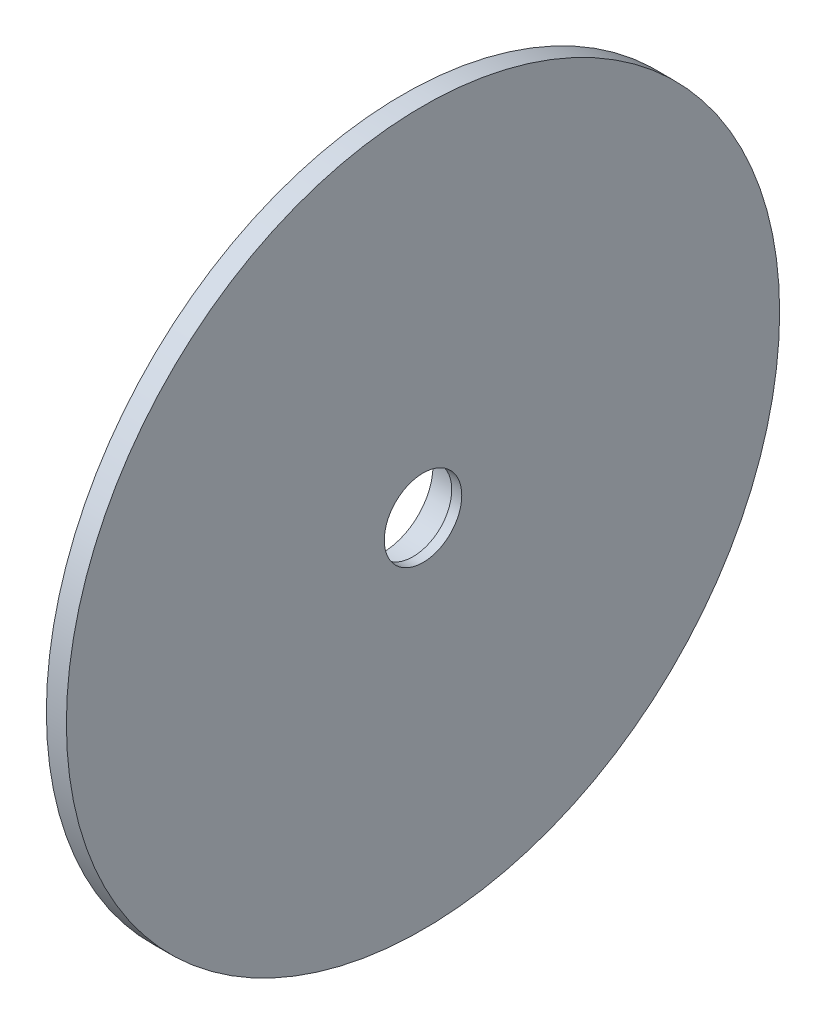
ISO-10303-21;
HEADER;
FILE_DESCRIPTION(('STEP AP214'),'2;1');
FILE_NAME('part.step','',(''),(''),'','','');
FILE_SCHEMA(('AUTOMOTIVE_DESIGN { 1 0 10303 214 1 1 1 1 }'));
ENDSEC;
DATA;
#1=APPLICATION_CONTEXT('core data for automotive mechanical design processes');
#2=APPLICATION_PROTOCOL_DEFINITION('international standard','automotive_design',2000,#1);
#3=PRODUCT_CONTEXT('',#1,'mechanical');
#4=PRODUCT('Part','Part','',(#3));
#5=PRODUCT_RELATED_PRODUCT_CATEGORY('part','',(#4));
#6=PRODUCT_DEFINITION_FORMATION('','',#4);
#7=PRODUCT_DEFINITION_CONTEXT('part definition',#1,'design');
#8=PRODUCT_DEFINITION('design','',#6,#7);
#9=PRODUCT_DEFINITION_SHAPE('','',#8);
#10=(LENGTH_UNIT() NAMED_UNIT(*) SI_UNIT(.MILLI.,.METRE.));
#11=(NAMED_UNIT(*) PLANE_ANGLE_UNIT() SI_UNIT($,.RADIAN.));
#12=(NAMED_UNIT(*) SI_UNIT($,.STERADIAN.) SOLID_ANGLE_UNIT());
#13=UNCERTAINTY_MEASURE_WITH_UNIT(LENGTH_MEASURE(1.E-05),#10,'distance_accuracy_value','');
#14=(GEOMETRIC_REPRESENTATION_CONTEXT(3) GLOBAL_UNCERTAINTY_ASSIGNED_CONTEXT((#13)) GLOBAL_UNIT_ASSIGNED_CONTEXT((#10,
#11,#12)) REPRESENTATION_CONTEXT('',''));
#15=CARTESIAN_POINT('',(0.,0.,0.));
#16=DIRECTION('',(0.,0.,1.));
#17=DIRECTION('',(1.,0.,0.));
#18=AXIS2_PLACEMENT_3D('',#15,#16,#17);
#19=CARTESIAN_POINT('',(0.,0.,0.));
#20=DIRECTION('',(1.,0.,0.));
#21=DIRECTION('',(0.,0.,-1.));
#22=AXIS2_PLACEMENT_3D('',#19,#20,#21);
#23=CYLINDRICAL_SURFACE('',#22,15.4807692307692);
#24=CARTESIAN_POINT('',(-3.25233850040408,0.,0.));
#25=DIRECTION('',(1.,0.,0.));
#26=DIRECTION('',(0.,0.,-1.));
#27=AXIS2_PLACEMENT_3D('',#24,#25,#26);
#28=CIRCLE('',#27,15.4807692307692);
#29=CARTESIAN_POINT('',(-3.25233850040408,0.,-15.4807692307692));
#30=VERTEX_POINT('',#29);
#31=EDGE_CURVE('E10',#30,#30,#28,.T.);
#32=ORIENTED_EDGE('',*,*,#31,.T.);
#33=EDGE_LOOP('',(#32));
#34=FACE_BOUND('',#33,.T.);
#35=CARTESIAN_POINT('',(-7.25233850040408,0.,0.));
#36=DIRECTION('',(1.,0.,0.));
#37=DIRECTION('',(0.,0.,-1.));
#38=AXIS2_PLACEMENT_3D('',#35,#36,#37);
#39=CIRCLE('',#38,15.4807692307692);
#40=CARTESIAN_POINT('',(-7.25233850040408,0.,-15.4807692307692));
#41=VERTEX_POINT('',#40);
#42=EDGE_CURVE('E42',#41,#41,#39,.T.);
#43=ORIENTED_EDGE('',*,*,#42,.F.);
#44=EDGE_LOOP('',(#43));
#45=FACE_BOUND('',#44,.T.);
#46=ADVANCED_FACE('F36',(#34,#45),#23,.F.);
#47=CARTESIAN_POINT('',(-7.25233850040408,15.4807692307692,0.));
#48=DIRECTION('',(-1.,0.,0.));
#49=DIRECTION('',(0.,0.,1.));
#50=AXIS2_PLACEMENT_3D('',#47,#48,#49);
#51=PLANE('',#50);
#52=ORIENTED_EDGE('',*,*,#42,.T.);
#53=EDGE_LOOP('',(#52));
#54=FACE_BOUND('',#53,.T.);
#55=CARTESIAN_POINT('',(-7.25233850040408,0.,0.));
#56=DIRECTION('',(1.,0.,0.));
#57=DIRECTION('',(0.,0.,-1.));
#58=AXIS2_PLACEMENT_3D('',#55,#56,#57);
#59=CIRCLE('',#58,20.);
#60=CARTESIAN_POINT('',(-7.25233850040408,0.,-20.));
#61=VERTEX_POINT('',#60);
#62=EDGE_CURVE('E46',#61,#61,#59,.T.);
#63=ORIENTED_EDGE('',*,*,#62,.F.);
#64=EDGE_LOOP('',(#63));
#65=FACE_BOUND('',#64,.T.);
#66=ADVANCED_FACE('F105',(#54,#65),#51,.T.);
#67=CARTESIAN_POINT('',(0.,0.,0.));
#68=DIRECTION('',(1.,0.,0.));
#69=DIRECTION('',(0.,0.,-1.));
#70=AXIS2_PLACEMENT_3D('',#67,#68,#69);
#71=CYLINDRICAL_SURFACE('',#70,20.);
#72=ORIENTED_EDGE('',*,*,#62,.T.);
#73=EDGE_LOOP('',(#72));
#74=FACE_BOUND('',#73,.T.);
#75=CARTESIAN_POINT('',(-19.2523385004041,0.,0.));
#76=DIRECTION('',(1.,0.,0.));
#77=DIRECTION('',(0.,0.,-1.));
#78=AXIS2_PLACEMENT_3D('',#75,#76,#77);
#79=CIRCLE('',#78,20.);
#80=CARTESIAN_POINT('',(-19.2523385004041,0.,-20.));
#81=VERTEX_POINT('',#80);
#82=EDGE_CURVE('E50',#81,#81,#79,.T.);
#83=ORIENTED_EDGE('',*,*,#82,.F.);
#84=EDGE_LOOP('',(#83));
#85=FACE_BOUND('',#84,.T.);
#86=ADVANCED_FACE('F109',(#74,#85),#71,.F.);
#87=CARTESIAN_POINT('',(-19.2523385004041,92.0482890243246,0.));
#88=DIRECTION('',(-1.,0.,0.));
#89=DIRECTION('',(0.,0.,1.));
#90=AXIS2_PLACEMENT_3D('',#87,#88,#89);
#91=PLANE('',#90);
#92=ORIENTED_EDGE('',*,*,#82,.T.);
#93=EDGE_LOOP('',(#92));
#94=FACE_BOUND('',#93,.T.);
#95=CARTESIAN_POINT('',(-19.2523385004041,0.,0.));
#96=DIRECTION('',(1.,0.,0.));
#97=DIRECTION('',(0.,0.,-1.));
#98=AXIS2_PLACEMENT_3D('',#95,#96,#97);
#99=CIRCLE('',#98,92.0482890243246);
#100=CARTESIAN_POINT('',(-19.2523385004041,0.,-92.0482890243246));
#101=VERTEX_POINT('',#100);
#102=EDGE_CURVE('E55',#101,#101,#99,.T.);
#103=ORIENTED_EDGE('',*,*,#102,.F.);
#104=EDGE_LOOP('',(#103));
#105=FACE_BOUND('',#104,.T.);
#106=ADVANCED_FACE('F114',(#94,#105),#91,.T.);
#107=CARTESIAN_POINT('',(0.,0.,0.));
#108=DIRECTION('',(1.,0.,0.));
#109=DIRECTION('',(0.,0.,-1.));
#110=AXIS2_PLACEMENT_3D('',#107,#108,#109);
#111=CYLINDRICAL_SURFACE('',#110,92.0482890243246);
#112=ORIENTED_EDGE('',*,*,#102,.T.);
#113=EDGE_LOOP('',(#112));
#114=FACE_BOUND('',#113,.T.);
#115=CARTESIAN_POINT('',(-26.2523385004041,0.,0.));
#116=DIRECTION('',(1.,0.,0.));
#117=DIRECTION('',(0.,0.,-1.));
#118=AXIS2_PLACEMENT_3D('',#115,#116,#117);
#119=CIRCLE('',#118,92.0482890243246);
#120=CARTESIAN_POINT('',(-26.2523385004041,0.,-92.0482890243246));
#121=VERTEX_POINT('',#120);
#122=EDGE_CURVE('E59',#121,#121,#119,.T.);
#123=ORIENTED_EDGE('',*,*,#122,.F.);
#124=EDGE_LOOP('',(#123));
#125=FACE_BOUND('',#124,.T.);
#126=ADVANCED_FACE('F121',(#114,#125),#111,.F.);
#127=CARTESIAN_POINT('',(-26.2523385004041,100.,0.));
#128=DIRECTION('',(-1.,0.,0.));
#129=DIRECTION('',(0.,0.,1.));
#130=AXIS2_PLACEMENT_3D('',#127,#128,#129);
#131=PLANE('',#130);
#132=ORIENTED_EDGE('',*,*,#122,.T.);
#133=EDGE_LOOP('',(#132));
#134=FACE_BOUND('',#133,.T.);
#135=CARTESIAN_POINT('',(-26.2523385004041,0.,0.));
#136=DIRECTION('',(1.,0.,0.));
#137=DIRECTION('',(0.,0.,-1.));
#138=AXIS2_PLACEMENT_3D('',#135,#136,#137);
#139=CIRCLE('',#138,100.);
#140=CARTESIAN_POINT('',(-26.2523385004041,0.,-100.));
#141=VERTEX_POINT('',#140);
#142=EDGE_CURVE('E63',#141,#141,#139,.T.);
#143=ORIENTED_EDGE('',*,*,#142,.F.);
#144=EDGE_LOOP('',(#143));
#145=FACE_BOUND('',#144,.T.);
#146=ADVANCED_FACE('F125',(#134,#145),#131,.T.);
#147=CARTESIAN_POINT('',(0.,0.,0.));
#148=DIRECTION('',(1.,0.,0.));
#149=DIRECTION('',(0.,0.,-1.));
#150=AXIS2_PLACEMENT_3D('',#147,#148,#149);
#151=CYLINDRICAL_SURFACE('',#150,100.);
#152=ORIENTED_EDGE('',*,*,#142,.T.);
#153=EDGE_LOOP('',(#152));
#154=FACE_BOUND('',#153,.T.);
#155=CARTESIAN_POINT('',(-32.2682092858716,0.,0.));
#156=DIRECTION('',(1.,0.,0.));
#157=DIRECTION('',(0.,0.,-1.));
#158=AXIS2_PLACEMENT_3D('',#155,#156,#157);
#159=CIRCLE('',#158,100.);
#160=CARTESIAN_POINT('',(-32.2682092858716,0.,-100.));
#161=VERTEX_POINT('',#160);
#162=EDGE_CURVE('E67',#161,#161,#159,.T.);
#163=ORIENTED_EDGE('',*,*,#162,.F.);
#164=EDGE_LOOP('',(#163));
#165=FACE_BOUND('',#164,.T.);
#166=ADVANCED_FACE('F129',(#154,#165),#151,.F.);
#167=CARTESIAN_POINT('',(-32.2682092858716,100.,0.));
#168=DIRECTION('',(-1.,0.,0.));
#169=DIRECTION('',(0.,0.,1.));
#170=AXIS2_PLACEMENT_3D('',#167,#168,#169);
#171=PLANE('',#170);
#172=ORIENTED_EDGE('',*,*,#162,.T.);
#173=EDGE_LOOP('',(#172));
#174=FACE_BOUND('',#173,.T.);
#175=CARTESIAN_POINT('',(-32.2682092858716,0.,0.));
#176=DIRECTION('',(1.,0.,0.));
#177=DIRECTION('',(0.,0.,-1.));
#178=AXIS2_PLACEMENT_3D('',#175,#176,#177);
#179=CIRCLE('',#178,105.);
#180=CARTESIAN_POINT('',(-32.2682092858716,0.,-105.));
#181=VERTEX_POINT('',#180);
#182=EDGE_CURVE('E71',#181,#181,#179,.T.);
#183=ORIENTED_EDGE('',*,*,#182,.F.);
#184=EDGE_LOOP('',(#183));
#185=FACE_BOUND('',#184,.T.);
#186=ADVANCED_FACE('F133',(#174,#185),#171,.T.);
#187=CARTESIAN_POINT('',(0.,0.,0.));
#188=DIRECTION('',(1.,0.,0.));
#189=DIRECTION('',(0.,0.,-1.));
#190=AXIS2_PLACEMENT_3D('',#187,#188,#189);
#191=CYLINDRICAL_SURFACE('',#190,105.);
#192=ORIENTED_EDGE('',*,*,#182,.T.);
#193=EDGE_LOOP('',(#192));
#194=FACE_BOUND('',#193,.T.);
#195=CARTESIAN_POINT('',(-11.2523385004041,0.,0.));
#196=DIRECTION('',(1.,0.,0.));
#197=DIRECTION('',(0.,0.,-1.));
#198=AXIS2_PLACEMENT_3D('',#195,#196,#197);
#199=CIRCLE('',#198,105.);
#200=CARTESIAN_POINT('',(-11.2523385004041,0.,-105.));
#201=VERTEX_POINT('',#200);
#202=EDGE_CURVE('E75',#201,#201,#199,.T.);
#203=ORIENTED_EDGE('',*,*,#202,.F.);
#204=EDGE_LOOP('',(#203));
#205=FACE_BOUND('',#204,.T.);
#206=ADVANCED_FACE('F101',(#194,#205),#191,.T.);
#207=CARTESIAN_POINT('',(-11.2523385004041,142.480769230769,0.));
#208=DIRECTION('',(-1.,0.,0.));
#209=DIRECTION('',(0.,0.,1.));
#210=AXIS2_PLACEMENT_3D('',#207,#208,#209);
#211=PLANE('',#210);
#212=ORIENTED_EDGE('',*,*,#202,.T.);
#213=EDGE_LOOP('',(#212));
#214=FACE_BOUND('',#213,.T.);
#215=CARTESIAN_POINT('',(-11.2523385004041,0.,0.));
#216=DIRECTION('',(1.,0.,0.));
#217=DIRECTION('',(0.,0.,-1.));
#218=AXIS2_PLACEMENT_3D('',#215,#216,#217);
#219=CIRCLE('',#218,142.480769230769);
#220=CARTESIAN_POINT('',(-11.2523385004041,0.,-142.480769230769));
#221=VERTEX_POINT('',#220);
#222=EDGE_CURVE('E79',#221,#221,#219,.T.);
#223=ORIENTED_EDGE('',*,*,#222,.F.);
#224=EDGE_LOOP('',(#223));
#225=FACE_BOUND('',#224,.T.);
#226=ADVANCED_FACE('F93',(#214,#225),#211,.T.);
#227=CARTESIAN_POINT('',(0.,0.,0.));
#228=DIRECTION('',(1.,0.,0.));
#229=DIRECTION('',(0.,0.,-1.));
#230=AXIS2_PLACEMENT_3D('',#227,#228,#229);
#231=CYLINDRICAL_SURFACE('',#230,142.480769230769);
#232=ORIENTED_EDGE('',*,*,#222,.T.);
#233=EDGE_LOOP('',(#232));
#234=FACE_BOUND('',#233,.T.);
#235=CARTESIAN_POINT('',(-3.25233850040409,0.,0.));
#236=DIRECTION('',(1.,0.,0.));
#237=DIRECTION('',(0.,0.,-1.));
#238=AXIS2_PLACEMENT_3D('',#235,#236,#237);
#239=CIRCLE('',#238,142.480769230769);
#240=CARTESIAN_POINT('',(-3.25233850040409,0.,-142.480769230769));
#241=VERTEX_POINT('',#240);
#242=EDGE_CURVE('E83',#241,#241,#239,.T.);
#243=ORIENTED_EDGE('',*,*,#242,.F.);
#244=EDGE_LOOP('',(#243));
#245=FACE_BOUND('',#244,.T.);
#246=ADVANCED_FACE('F91',(#234,#245),#231,.T.);
#247=CARTESIAN_POINT('',(-3.25233850040409,105.,0.));
#248=DIRECTION('',(1.,0.,0.));
#249=DIRECTION('',(0.,0.,-1.));
#250=AXIS2_PLACEMENT_3D('',#247,#248,#249);
#251=PLANE('',#250);
#252=ORIENTED_EDGE('',*,*,#242,.T.);
#253=EDGE_LOOP('',(#252));
#254=FACE_BOUND('',#253,.T.);
#255=ORIENTED_EDGE('',*,*,#31,.F.);
#256=EDGE_LOOP('',(#255));
#257=FACE_BOUND('',#256,.T.);
#258=ADVANCED_FACE('F88',(#254,#257),#251,.T.);
#259=CLOSED_SHELL('',(#46,#66,#86,#106,#126,#146,#166,#186,#206,#226,#246,#258));
#260=MANIFOLD_SOLID_BREP('B2',#259);
#261=ADVANCED_BREP_SHAPE_REPRESENTATION('',(#18,#260),#14);
#262=SHAPE_DEFINITION_REPRESENTATION(#9,#261);
ENDSEC;
END-ISO-10303-21;
